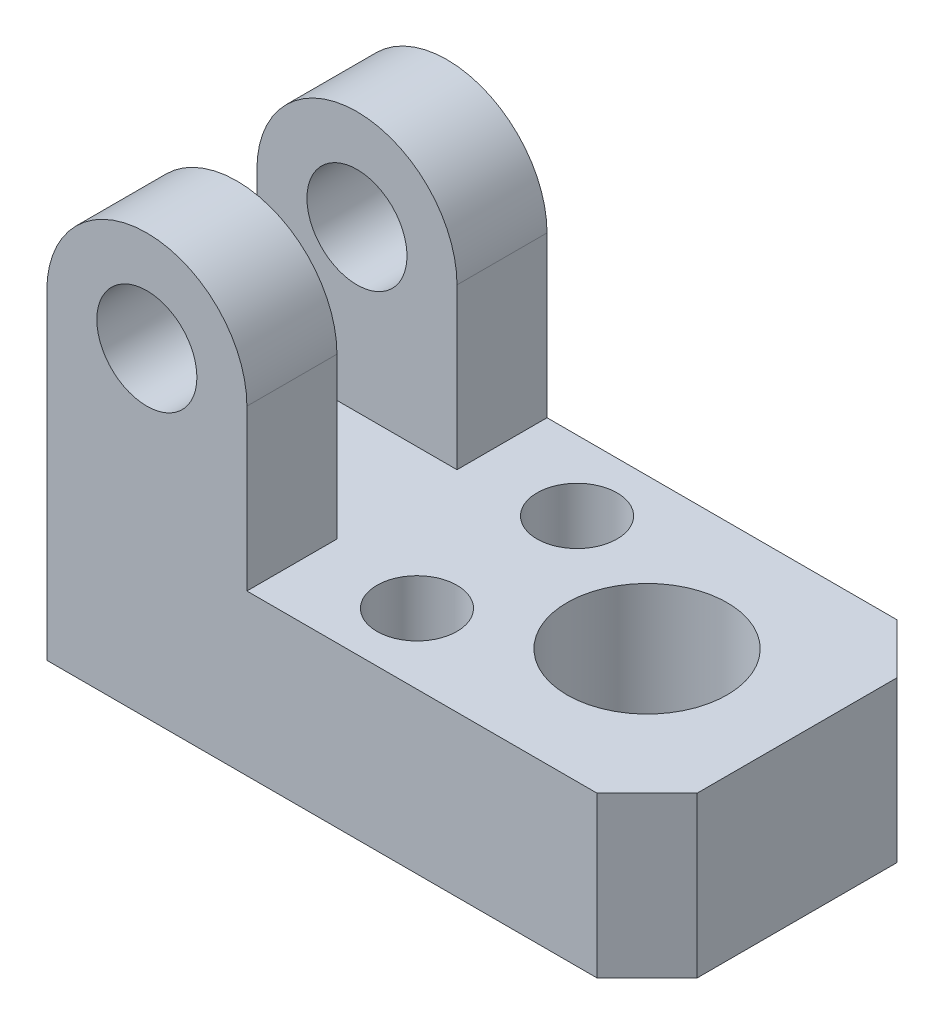
ISO-10303-21;
HEADER;
FILE_DESCRIPTION(('STEP AP214'),'2;1');
FILE_NAME('part.step','',(''),(''),'','','');
FILE_SCHEMA(('AUTOMOTIVE_DESIGN { 1 0 10303 214 1 1 1 1 }'));
ENDSEC;
DATA;
#1=APPLICATION_CONTEXT('core data for automotive mechanical design processes');
#2=APPLICATION_PROTOCOL_DEFINITION('international standard','automotive_design',2000,#1);
#3=PRODUCT_CONTEXT('',#1,'mechanical');
#4=PRODUCT('Part','Part','',(#3));
#5=PRODUCT_RELATED_PRODUCT_CATEGORY('part','',(#4));
#6=PRODUCT_DEFINITION_FORMATION('','',#4);
#7=PRODUCT_DEFINITION_CONTEXT('part definition',#1,'design');
#8=PRODUCT_DEFINITION('design','',#6,#7);
#9=PRODUCT_DEFINITION_SHAPE('','',#8);
#10=(LENGTH_UNIT() NAMED_UNIT(*) SI_UNIT(.MILLI.,.METRE.));
#11=(NAMED_UNIT(*) PLANE_ANGLE_UNIT() SI_UNIT($,.RADIAN.));
#12=(NAMED_UNIT(*) SI_UNIT($,.STERADIAN.) SOLID_ANGLE_UNIT());
#13=UNCERTAINTY_MEASURE_WITH_UNIT(LENGTH_MEASURE(1.E-05),#10,'distance_accuracy_value','');
#14=(GEOMETRIC_REPRESENTATION_CONTEXT(3) GLOBAL_UNCERTAINTY_ASSIGNED_CONTEXT((#13)) GLOBAL_UNIT_ASSIGNED_CONTEXT((#10,
#11,#12)) REPRESENTATION_CONTEXT('',''));
#15=CARTESIAN_POINT('',(0.,0.,0.));
#16=DIRECTION('',(0.,0.,1.));
#17=DIRECTION('',(1.,0.,0.));
#18=AXIS2_PLACEMENT_3D('',#15,#16,#17);
#19=CARTESIAN_POINT('',(0.,16.,0.));
#20=DIRECTION('',(0.,-1.,0.));
#21=DIRECTION('',(0.,0.,-1.));
#22=AXIS2_PLACEMENT_3D('',#19,#20,#21);
#23=PLANE('',#22);
#24=CARTESIAN_POINT('',(15.,16.,0.));
#25=DIRECTION('',(0.,1.,0.));
#26=DIRECTION('',(0.,0.,1.));
#27=AXIS2_PLACEMENT_3D('',#24,#25,#26);
#28=CIRCLE('',#27,8.);
#29=CARTESIAN_POINT('',(15.,16.,8.));
#30=VERTEX_POINT('',#29);
#31=EDGE_CURVE('E328',#30,#30,#28,.T.);
#32=ORIENTED_EDGE('',*,*,#31,.F.);
#33=EDGE_LOOP('',(#32));
#34=FACE_BOUND('',#33,.T.);
#35=CARTESIAN_POINT('',(0.,16.,8.));
#36=DIRECTION('',(0.,1.,0.));
#37=DIRECTION('',(0.,0.,1.));
#38=AXIS2_PLACEMENT_3D('',#35,#36,#37);
#39=CIRCLE('',#38,4.);
#40=CARTESIAN_POINT('',(0.,16.,12.));
#41=VERTEX_POINT('',#40);
#42=EDGE_CURVE('E325',#41,#41,#39,.T.);
#43=ORIENTED_EDGE('',*,*,#42,.F.);
#44=EDGE_LOOP('',(#43));
#45=FACE_BOUND('',#44,.T.);
#46=CARTESIAN_POINT('',(0.,16.,-8.));
#47=DIRECTION('',(0.,1.,0.));
#48=DIRECTION('',(0.,0.,-1.));
#49=AXIS2_PLACEMENT_3D('',#46,#47,#48);
#50=CIRCLE('',#49,4.);
#51=CARTESIAN_POINT('',(0.,16.,-12.));
#52=VERTEX_POINT('',#51);
#53=EDGE_CURVE('E319',#52,#52,#50,.T.);
#54=ORIENTED_EDGE('',*,*,#53,.F.);
#55=EDGE_LOOP('',(#54));
#56=FACE_BOUND('',#55,.T.);
#57=DIRECTION('',(1.,0.,0.));
#58=VECTOR('',#57,1.);
#59=CARTESIAN_POINT('',(-30.,16.,15.));
#60=LINE('',#59,#58);
#61=CARTESIAN_POINT('',(-10.,16.,15.));
#62=VERTEX_POINT('',#61);
#63=CARTESIAN_POINT('',(25.,16.,15.));
#64=VERTEX_POINT('',#63);
#65=EDGE_CURVE('E207',#62,#64,#60,.T.);
#66=ORIENTED_EDGE('',*,*,#65,.T.);
#67=DIRECTION('',(-0.707106781186549,0.,0.707106781186546));
#68=VECTOR('',#67,1.);
#69=CARTESIAN_POINT('',(30.,16.,9.99999999999999));
#70=LINE('',#69,#68);
#71=CARTESIAN_POINT('',(30.,16.,9.99999999999999));
#72=VERTEX_POINT('',#71);
#73=EDGE_CURVE('E50',#64,#72,#70,.F.);
#74=ORIENTED_EDGE('',*,*,#73,.T.);
#75=DIRECTION('',(0.,0.,-1.));
#76=VECTOR('',#75,1.);
#77=CARTESIAN_POINT('',(30.,16.,15.));
#78=LINE('',#77,#76);
#79=CARTESIAN_POINT('',(30.,16.,-9.99999999999997));
#80=VERTEX_POINT('',#79);
#81=EDGE_CURVE('E200',#72,#80,#78,.T.);
#82=ORIENTED_EDGE('',*,*,#81,.T.);
#83=DIRECTION('',(0.707106781186546,0.,0.707106781186549));
#84=VECTOR('',#83,1.);
#85=CARTESIAN_POINT('',(25.,16.,-15.));
#86=LINE('',#85,#84);
#87=CARTESIAN_POINT('',(25.,16.,-15.));
#88=VERTEX_POINT('',#87);
#89=EDGE_CURVE('E57',#80,#88,#86,.F.);
#90=ORIENTED_EDGE('',*,*,#89,.T.);
#91=DIRECTION('',(-1.,0.,0.));
#92=VECTOR('',#91,1.);
#93=CARTESIAN_POINT('',(-30.,16.,-15.));
#94=LINE('',#93,#92);
#95=CARTESIAN_POINT('',(-10.,16.,-15.));
#96=VERTEX_POINT('',#95);
#97=EDGE_CURVE('E202',#88,#96,#94,.T.);
#98=ORIENTED_EDGE('',*,*,#97,.T.);
#99=DIRECTION('',(0.,0.,-1.));
#100=VECTOR('',#99,1.);
#101=CARTESIAN_POINT('',(-10.,16.,-6.));
#102=LINE('',#101,#100);
#103=CARTESIAN_POINT('',(-10.,16.,-6.));
#104=VERTEX_POINT('',#103);
#105=EDGE_CURVE('E192',#104,#96,#102,.T.);
#106=ORIENTED_EDGE('',*,*,#105,.F.);
#107=DIRECTION('',(-1.,0.,0.));
#108=VECTOR('',#107,1.);
#109=CARTESIAN_POINT('',(-30.,16.,-6.));
#110=LINE('',#109,#108);
#111=CARTESIAN_POINT('',(-30.,16.,-6.));
#112=VERTEX_POINT('',#111);
#113=EDGE_CURVE('E183',#104,#112,#110,.T.);
#114=ORIENTED_EDGE('',*,*,#113,.T.);
#115=DIRECTION('',(0.,0.,1.));
#116=VECTOR('',#115,1.);
#117=CARTESIAN_POINT('',(-30.,16.,15.));
#118=LINE('',#117,#116);
#119=CARTESIAN_POINT('',(-30.,16.,6.));
#120=VERTEX_POINT('',#119);
#121=EDGE_CURVE('E205',#112,#120,#118,.T.);
#122=ORIENTED_EDGE('',*,*,#121,.T.);
#123=DIRECTION('',(-1.,0.,0.));
#124=VECTOR('',#123,1.);
#125=CARTESIAN_POINT('',(-30.,16.,6.));
#126=LINE('',#125,#124);
#127=CARTESIAN_POINT('',(-10.,16.,6.));
#128=VERTEX_POINT('',#127);
#129=EDGE_CURVE('E159',#128,#120,#126,.T.);
#130=ORIENTED_EDGE('',*,*,#129,.F.);
#131=DIRECTION('',(0.,0.,1.));
#132=VECTOR('',#131,1.);
#133=CARTESIAN_POINT('',(-10.,16.,6.));
#134=LINE('',#133,#132);
#135=EDGE_CURVE('E145',#128,#62,#134,.T.);
#136=ORIENTED_EDGE('',*,*,#135,.T.);
#137=EDGE_LOOP('',(#66,#74,#82,#90,#98,#106,#114,#122,#130,#136));
#138=FACE_BOUND('',#137,.T.);
#139=ADVANCED_FACE('F41',(#34,#45,#56,#138),#23,.F.);
#140=CARTESIAN_POINT('',(30.,16.,15.));
#141=DIRECTION('',(-1.,0.,0.));
#142=DIRECTION('',(0.,0.,1.));
#143=AXIS2_PLACEMENT_3D('',#140,#141,#142);
#144=PLANE('',#143);
#145=ORIENTED_EDGE('',*,*,#81,.F.);
#146=DIRECTION('',(0.,-1.,0.));
#147=VECTOR('',#146,1.);
#148=CARTESIAN_POINT('',(30.,16.,9.99999999999999));
#149=LINE('',#148,#147);
#150=CARTESIAN_POINT('',(30.,0.,9.99999999999999));
#151=VERTEX_POINT('',#150);
#152=EDGE_CURVE('E229',#72,#151,#149,.T.);
#153=ORIENTED_EDGE('',*,*,#152,.T.);
#154=DIRECTION('',(0.,0.,-1.));
#155=VECTOR('',#154,1.);
#156=CARTESIAN_POINT('',(30.,0.,15.));
#157=LINE('',#156,#155);
#158=CARTESIAN_POINT('',(30.,0.,-9.99999999999997));
#159=VERTEX_POINT('',#158);
#160=EDGE_CURVE('E195',#151,#159,#157,.T.);
#161=ORIENTED_EDGE('',*,*,#160,.T.);
#162=DIRECTION('',(0.,1.,0.));
#163=VECTOR('',#162,1.);
#164=CARTESIAN_POINT('',(30.,16.,-9.99999999999997));
#165=LINE('',#164,#163);
#166=EDGE_CURVE('E222',#159,#80,#165,.T.);
#167=ORIENTED_EDGE('',*,*,#166,.T.);
#168=EDGE_LOOP('',(#145,#153,#161,#167));
#169=FACE_BOUND('',#168,.T.);
#170=ADVANCED_FACE('F242',(#169),#144,.F.);
#171=CARTESIAN_POINT('',(-30.,16.,-15.));
#172=DIRECTION('',(0.,0.,1.));
#173=DIRECTION('',(1.,0.,0.));
#174=AXIS2_PLACEMENT_3D('',#171,#172,#173);
#175=PLANE('',#174);
#176=CARTESIAN_POINT('',(-20.,32.,-15.));
#177=DIRECTION('',(0.,0.,-1.));
#178=DIRECTION('',(-1.,0.,0.));
#179=AXIS2_PLACEMENT_3D('',#176,#177,#178);
#180=CIRCLE('',#179,5.);
#181=CARTESIAN_POINT('',(-25.,32.,-15.));
#182=VERTEX_POINT('',#181);
#183=EDGE_CURVE('E168',#182,#182,#180,.T.);
#184=ORIENTED_EDGE('',*,*,#183,.F.);
#185=EDGE_LOOP('',(#184));
#186=FACE_BOUND('',#185,.T.);
#187=ORIENTED_EDGE('',*,*,#97,.F.);
#188=DIRECTION('',(0.,-1.,0.));
#189=VECTOR('',#188,1.);
#190=CARTESIAN_POINT('',(25.,16.,-15.));
#191=LINE('',#190,#189);
#192=CARTESIAN_POINT('',(25.,0.,-15.));
#193=VERTEX_POINT('',#192);
#194=EDGE_CURVE('E11',#88,#193,#191,.T.);
#195=ORIENTED_EDGE('',*,*,#194,.T.);
#196=DIRECTION('',(-1.,0.,0.));
#197=VECTOR('',#196,1.);
#198=CARTESIAN_POINT('',(-30.,0.,-15.));
#199=LINE('',#198,#197);
#200=CARTESIAN_POINT('',(-30.,0.,-15.));
#201=VERTEX_POINT('',#200);
#202=EDGE_CURVE('E212',#193,#201,#199,.T.);
#203=ORIENTED_EDGE('',*,*,#202,.T.);
#204=DIRECTION('',(0.,-1.,0.));
#205=VECTOR('',#204,1.);
#206=CARTESIAN_POINT('',(-30.,16.,-15.));
#207=LINE('',#206,#205);
#208=CARTESIAN_POINT('',(-30.,32.,-15.));
#209=VERTEX_POINT('',#208);
#210=EDGE_CURVE('E219',#209,#201,#207,.T.);
#211=ORIENTED_EDGE('',*,*,#210,.F.);
#212=CARTESIAN_POINT('',(-20.,32.,-15.));
#213=DIRECTION('',(0.,0.,-1.));
#214=DIRECTION('',(-1.,0.,0.));
#215=AXIS2_PLACEMENT_3D('',#212,#213,#214);
#216=CIRCLE('',#215,10.);
#217=CARTESIAN_POINT('',(-10.,32.,-15.));
#218=VERTEX_POINT('',#217);
#219=EDGE_CURVE('E187',#209,#218,#216,.T.);
#220=ORIENTED_EDGE('',*,*,#219,.T.);
#221=DIRECTION('',(0.,-1.,0.));
#222=VECTOR('',#221,1.);
#223=CARTESIAN_POINT('',(-10.,16.,-15.));
#224=LINE('',#223,#222);
#225=EDGE_CURVE('E178',#218,#96,#224,.T.);
#226=ORIENTED_EDGE('',*,*,#225,.T.);
#227=EDGE_LOOP('',(#187,#195,#203,#211,#220,#226));
#228=FACE_BOUND('',#227,.T.);
#229=ADVANCED_FACE('F255',(#186,#228),#175,.F.);
#230=CARTESIAN_POINT('',(-30.,16.,15.));
#231=DIRECTION('',(1.,0.,0.));
#232=DIRECTION('',(0.,0.,-1.));
#233=AXIS2_PLACEMENT_3D('',#230,#231,#232);
#234=PLANE('',#233);
#235=DIRECTION('',(0.,0.,1.));
#236=VECTOR('',#235,1.);
#237=CARTESIAN_POINT('',(-30.,0.,15.));
#238=LINE('',#237,#236);
#239=CARTESIAN_POINT('',(-30.,0.,15.));
#240=VERTEX_POINT('',#239);
#241=EDGE_CURVE('E214',#201,#240,#238,.T.);
#242=ORIENTED_EDGE('',*,*,#241,.T.);
#243=DIRECTION('',(0.,-1.,0.));
#244=VECTOR('',#243,1.);
#245=CARTESIAN_POINT('',(-30.,16.,15.));
#246=LINE('',#245,#244);
#247=CARTESIAN_POINT('',(-30.,32.,15.));
#248=VERTEX_POINT('',#247);
#249=EDGE_CURVE('E209',#248,#240,#246,.T.);
#250=ORIENTED_EDGE('',*,*,#249,.F.);
#251=DIRECTION('',(0.,0.,1.));
#252=VECTOR('',#251,1.);
#253=CARTESIAN_POINT('',(-30.,32.,6.));
#254=LINE('',#253,#252);
#255=CARTESIAN_POINT('',(-30.,32.,6.));
#256=VERTEX_POINT('',#255);
#257=EDGE_CURVE('E155',#256,#248,#254,.T.);
#258=ORIENTED_EDGE('',*,*,#257,.F.);
#259=DIRECTION('',(0.,1.,0.));
#260=VECTOR('',#259,1.);
#261=CARTESIAN_POINT('',(-30.,16.,6.));
#262=LINE('',#261,#260);
#263=EDGE_CURVE('E141',#120,#256,#262,.T.);
#264=ORIENTED_EDGE('',*,*,#263,.F.);
#265=ORIENTED_EDGE('',*,*,#121,.F.);
#266=DIRECTION('',(0.,1.,0.));
#267=VECTOR('',#266,1.);
#268=CARTESIAN_POINT('',(-30.,16.,-6.));
#269=LINE('',#268,#267);
#270=CARTESIAN_POINT('',(-30.,32.,-6.));
#271=VERTEX_POINT('',#270);
#272=EDGE_CURVE('E174',#112,#271,#269,.T.);
#273=ORIENTED_EDGE('',*,*,#272,.T.);
#274=DIRECTION('',(0.,0.,-1.));
#275=VECTOR('',#274,1.);
#276=CARTESIAN_POINT('',(-30.,32.,-6.));
#277=LINE('',#276,#275);
#278=EDGE_CURVE('E186',#271,#209,#277,.T.);
#279=ORIENTED_EDGE('',*,*,#278,.T.);
#280=ORIENTED_EDGE('',*,*,#210,.T.);
#281=EDGE_LOOP('',(#242,#250,#258,#264,#265,#273,#279,#280));
#282=FACE_BOUND('',#281,.T.);
#283=ADVANCED_FACE('F252',(#282),#234,.F.);
#284=CARTESIAN_POINT('',(-30.,16.,15.));
#285=DIRECTION('',(0.,0.,-1.));
#286=DIRECTION('',(-1.,0.,0.));
#287=AXIS2_PLACEMENT_3D('',#284,#285,#286);
#288=PLANE('',#287);
#289=CARTESIAN_POINT('',(-20.,32.,15.));
#290=DIRECTION('',(0.,0.,-1.));
#291=DIRECTION('',(-1.,0.,0.));
#292=AXIS2_PLACEMENT_3D('',#289,#290,#291);
#293=CIRCLE('',#292,5.);
#294=CARTESIAN_POINT('',(-25.,32.,15.));
#295=VERTEX_POINT('',#294);
#296=EDGE_CURVE('E227',#295,#295,#293,.T.);
#297=ORIENTED_EDGE('',*,*,#296,.T.);
#298=EDGE_LOOP('',(#297));
#299=FACE_BOUND('',#298,.T.);
#300=DIRECTION('',(1.,0.,0.));
#301=VECTOR('',#300,1.);
#302=CARTESIAN_POINT('',(-30.,0.,15.));
#303=LINE('',#302,#301);
#304=CARTESIAN_POINT('',(25.,0.,15.));
#305=VERTEX_POINT('',#304);
#306=EDGE_CURVE('E203',#240,#305,#303,.T.);
#307=ORIENTED_EDGE('',*,*,#306,.T.);
#308=DIRECTION('',(0.,1.,0.));
#309=VECTOR('',#308,1.);
#310=CARTESIAN_POINT('',(25.,16.,15.));
#311=LINE('',#310,#309);
#312=EDGE_CURVE('E65',#305,#64,#311,.T.);
#313=ORIENTED_EDGE('',*,*,#312,.T.);
#314=ORIENTED_EDGE('',*,*,#65,.F.);
#315=DIRECTION('',(0.,-1.,0.));
#316=VECTOR('',#315,1.);
#317=CARTESIAN_POINT('',(-10.,16.,15.));
#318=LINE('',#317,#316);
#319=CARTESIAN_POINT('',(-10.,32.,15.));
#320=VERTEX_POINT('',#319);
#321=EDGE_CURVE('E164',#320,#62,#318,.T.);
#322=ORIENTED_EDGE('',*,*,#321,.F.);
#323=CARTESIAN_POINT('',(-20.,32.,15.));
#324=DIRECTION('',(0.,0.,-1.));
#325=DIRECTION('',(-1.,0.,0.));
#326=AXIS2_PLACEMENT_3D('',#323,#324,#325);
#327=CIRCLE('',#326,10.);
#328=EDGE_CURVE('E151',#248,#320,#327,.T.);
#329=ORIENTED_EDGE('',*,*,#328,.F.);
#330=ORIENTED_EDGE('',*,*,#249,.T.);
#331=EDGE_LOOP('',(#307,#313,#314,#322,#329,#330));
#332=FACE_BOUND('',#331,.T.);
#333=ADVANCED_FACE('F250',(#299,#332),#288,.F.);
#334=CARTESIAN_POINT('',(0.,0.,0.));
#335=DIRECTION('',(0.,-1.,0.));
#336=DIRECTION('',(0.,0.,-1.));
#337=AXIS2_PLACEMENT_3D('',#334,#335,#336);
#338=PLANE('',#337);
#339=CARTESIAN_POINT('',(15.,0.,0.));
#340=DIRECTION('',(0.,1.,0.));
#341=DIRECTION('',(0.,0.,1.));
#342=AXIS2_PLACEMENT_3D('',#339,#340,#341);
#343=CIRCLE('',#342,8.);
#344=CARTESIAN_POINT('',(15.,0.,8.));
#345=VERTEX_POINT('',#344);
#346=EDGE_CURVE('E315',#345,#345,#343,.T.);
#347=ORIENTED_EDGE('',*,*,#346,.T.);
#348=EDGE_LOOP('',(#347));
#349=FACE_BOUND('',#348,.T.);
#350=CARTESIAN_POINT('',(0.,0.,8.));
#351=DIRECTION('',(0.,1.,0.));
#352=DIRECTION('',(0.,0.,1.));
#353=AXIS2_PLACEMENT_3D('',#350,#351,#352);
#354=CIRCLE('',#353,4.);
#355=CARTESIAN_POINT('',(0.,0.,12.));
#356=VERTEX_POINT('',#355);
#357=EDGE_CURVE('E322',#356,#356,#354,.T.);
#358=ORIENTED_EDGE('',*,*,#357,.T.);
#359=EDGE_LOOP('',(#358));
#360=FACE_BOUND('',#359,.T.);
#361=CARTESIAN_POINT('',(0.,0.,-8.));
#362=DIRECTION('',(0.,1.,0.));
#363=DIRECTION('',(0.,0.,-1.));
#364=AXIS2_PLACEMENT_3D('',#361,#362,#363);
#365=CIRCLE('',#364,4.);
#366=CARTESIAN_POINT('',(0.,0.,-12.));
#367=VERTEX_POINT('',#366);
#368=EDGE_CURVE('E316',#367,#367,#365,.T.);
#369=ORIENTED_EDGE('',*,*,#368,.T.);
#370=EDGE_LOOP('',(#369));
#371=FACE_BOUND('',#370,.T.);
#372=ORIENTED_EDGE('',*,*,#160,.F.);
#373=DIRECTION('',(0.707106781186549,0.,-0.707106781186546));
#374=VECTOR('',#373,1.);
#375=CARTESIAN_POINT('',(19.9999999999999,0.,20.));
#376=LINE('',#375,#374);
#377=EDGE_CURVE('E234',#151,#305,#376,.F.);
#378=ORIENTED_EDGE('',*,*,#377,.T.);
#379=ORIENTED_EDGE('',*,*,#306,.F.);
#380=ORIENTED_EDGE('',*,*,#241,.F.);
#381=ORIENTED_EDGE('',*,*,#202,.F.);
#382=DIRECTION('',(-0.707106781186546,0.,-0.707106781186549));
#383=VECTOR('',#382,1.);
#384=CARTESIAN_POINT('',(20.,0.,-20.));
#385=LINE('',#384,#383);
#386=EDGE_CURVE('E232',#193,#159,#385,.F.);
#387=ORIENTED_EDGE('',*,*,#386,.T.);
#388=EDGE_LOOP('',(#372,#378,#379,#380,#381,#387));
#389=FACE_BOUND('',#388,.T.);
#390=ADVANCED_FACE('F248',(#349,#360,#371,#389),#338,.T.);
#391=CARTESIAN_POINT('',(-10.,16.,-6.));
#392=DIRECTION('',(1.,0.,0.));
#393=DIRECTION('',(0.,0.,-1.));
#394=AXIS2_PLACEMENT_3D('',#391,#392,#393);
#395=PLANE('',#394);
#396=ORIENTED_EDGE('',*,*,#225,.F.);
#397=DIRECTION('',(0.,0.,-1.));
#398=VECTOR('',#397,1.);
#399=CARTESIAN_POINT('',(-10.,32.,-6.));
#400=LINE('',#399,#398);
#401=CARTESIAN_POINT('',(-10.,32.,-6.));
#402=VERTEX_POINT('',#401);
#403=EDGE_CURVE('E196',#402,#218,#400,.T.);
#404=ORIENTED_EDGE('',*,*,#403,.F.);
#405=DIRECTION('',(0.,-1.,0.));
#406=VECTOR('',#405,1.);
#407=CARTESIAN_POINT('',(-10.,16.,-6.));
#408=LINE('',#407,#406);
#409=EDGE_CURVE('E181',#402,#104,#408,.T.);
#410=ORIENTED_EDGE('',*,*,#409,.T.);
#411=ORIENTED_EDGE('',*,*,#105,.T.);
#412=EDGE_LOOP('',(#396,#404,#410,#411));
#413=FACE_BOUND('',#412,.T.);
#414=ADVANCED_FACE('F279',(#413),#395,.T.);
#415=CARTESIAN_POINT('',(-20.,32.,-6.));
#416=DIRECTION('',(0.,0.,-1.));
#417=DIRECTION('',(-1.,0.,0.));
#418=AXIS2_PLACEMENT_3D('',#415,#416,#417);
#419=CYLINDRICAL_SURFACE('',#418,10.);
#420=ORIENTED_EDGE('',*,*,#219,.F.);
#421=ORIENTED_EDGE('',*,*,#278,.F.);
#422=CARTESIAN_POINT('',(-20.,32.,-6.));
#423=DIRECTION('',(0.,0.,-1.));
#424=DIRECTION('',(-1.,0.,0.));
#425=AXIS2_PLACEMENT_3D('',#422,#423,#424);
#426=CIRCLE('',#425,10.);
#427=EDGE_CURVE('E177',#271,#402,#426,.T.);
#428=ORIENTED_EDGE('',*,*,#427,.T.);
#429=ORIENTED_EDGE('',*,*,#403,.T.);
#430=EDGE_LOOP('',(#420,#421,#428,#429));
#431=FACE_BOUND('',#430,.T.);
#432=ADVANCED_FACE('F275',(#431),#419,.T.);
#433=CARTESIAN_POINT('',(-20.,32.,-6.));
#434=DIRECTION('',(0.,0.,-1.));
#435=DIRECTION('',(-1.,0.,0.));
#436=AXIS2_PLACEMENT_3D('',#433,#434,#435);
#437=PLANE('',#436);
#438=CARTESIAN_POINT('',(-20.,32.,-6.));
#439=DIRECTION('',(0.,0.,-1.));
#440=DIRECTION('',(-1.,0.,0.));
#441=AXIS2_PLACEMENT_3D('',#438,#439,#440);
#442=CIRCLE('',#441,5.);
#443=CARTESIAN_POINT('',(-25.,32.,-6.));
#444=VERTEX_POINT('',#443);
#445=EDGE_CURVE('E173',#444,#444,#442,.T.);
#446=ORIENTED_EDGE('',*,*,#445,.T.);
#447=EDGE_LOOP('',(#446));
#448=FACE_BOUND('',#447,.T.);
#449=ORIENTED_EDGE('',*,*,#272,.F.);
#450=ORIENTED_EDGE('',*,*,#113,.F.);
#451=ORIENTED_EDGE('',*,*,#409,.F.);
#452=ORIENTED_EDGE('',*,*,#427,.F.);
#453=EDGE_LOOP('',(#449,#450,#451,#452));
#454=FACE_BOUND('',#453,.T.);
#455=ADVANCED_FACE('F300',(#448,#454),#437,.F.);
#456=CARTESIAN_POINT('',(-20.,32.,15.));
#457=DIRECTION('',(0.,0.,-1.));
#458=DIRECTION('',(-1.,0.,0.));
#459=AXIS2_PLACEMENT_3D('',#456,#457,#458);
#460=CYLINDRICAL_SURFACE('',#459,5.);
#461=ORIENTED_EDGE('',*,*,#183,.T.);
#462=EDGE_LOOP('',(#461));
#463=FACE_BOUND('',#462,.T.);
#464=ORIENTED_EDGE('',*,*,#445,.F.);
#465=EDGE_LOOP('',(#464));
#466=FACE_BOUND('',#465,.T.);
#467=ADVANCED_FACE('F297',(#463,#466),#460,.F.);
#468=CARTESIAN_POINT('',(-20.,32.,6.));
#469=DIRECTION('',(0.,0.,1.));
#470=DIRECTION('',(1.,0.,0.));
#471=AXIS2_PLACEMENT_3D('',#468,#469,#470);
#472=CYLINDRICAL_SURFACE('',#471,10.);
#473=ORIENTED_EDGE('',*,*,#328,.T.);
#474=DIRECTION('',(0.,0.,1.));
#475=VECTOR('',#474,1.);
#476=CARTESIAN_POINT('',(-10.,32.,6.));
#477=LINE('',#476,#475);
#478=CARTESIAN_POINT('',(-10.,32.,6.));
#479=VERTEX_POINT('',#478);
#480=EDGE_CURVE('E148',#479,#320,#477,.T.);
#481=ORIENTED_EDGE('',*,*,#480,.F.);
#482=CARTESIAN_POINT('',(-20.,32.,6.));
#483=DIRECTION('',(0.,0.,-1.));
#484=DIRECTION('',(-1.,0.,0.));
#485=AXIS2_PLACEMENT_3D('',#482,#483,#484);
#486=CIRCLE('',#485,10.);
#487=EDGE_CURVE('E133',#256,#479,#486,.T.);
#488=ORIENTED_EDGE('',*,*,#487,.F.);
#489=ORIENTED_EDGE('',*,*,#257,.T.);
#490=EDGE_LOOP('',(#473,#481,#488,#489));
#491=FACE_BOUND('',#490,.T.);
#492=ADVANCED_FACE('F149',(#491),#472,.T.);
#493=CARTESIAN_POINT('',(-10.,16.,6.));
#494=DIRECTION('',(-1.,0.,0.));
#495=DIRECTION('',(0.,0.,1.));
#496=AXIS2_PLACEMENT_3D('',#493,#494,#495);
#497=PLANE('',#496);
#498=ORIENTED_EDGE('',*,*,#321,.T.);
#499=ORIENTED_EDGE('',*,*,#135,.F.);
#500=DIRECTION('',(0.,-1.,0.));
#501=VECTOR('',#500,1.);
#502=CARTESIAN_POINT('',(-10.,16.,6.));
#503=LINE('',#502,#501);
#504=EDGE_CURVE('E138',#479,#128,#503,.T.);
#505=ORIENTED_EDGE('',*,*,#504,.F.);
#506=ORIENTED_EDGE('',*,*,#480,.T.);
#507=EDGE_LOOP('',(#498,#499,#505,#506));
#508=FACE_BOUND('',#507,.T.);
#509=ADVANCED_FACE('F157',(#508),#497,.F.);
#510=CARTESIAN_POINT('',(-20.,32.,6.));
#511=DIRECTION('',(0.,0.,1.));
#512=DIRECTION('',(-1.,0.,0.));
#513=AXIS2_PLACEMENT_3D('',#510,#511,#512);
#514=PLANE('',#513);
#515=CARTESIAN_POINT('',(-20.,32.,6.));
#516=DIRECTION('',(0.,0.,1.));
#517=DIRECTION('',(1.,0.,0.));
#518=AXIS2_PLACEMENT_3D('',#515,#516,#517);
#519=CIRCLE('',#518,5.);
#520=CARTESIAN_POINT('',(-15.,32.,6.));
#521=VERTEX_POINT('',#520);
#522=EDGE_CURVE('E166',#521,#521,#519,.F.);
#523=ORIENTED_EDGE('',*,*,#522,.F.);
#524=EDGE_LOOP('',(#523));
#525=FACE_BOUND('',#524,.T.);
#526=ORIENTED_EDGE('',*,*,#263,.T.);
#527=ORIENTED_EDGE('',*,*,#487,.T.);
#528=ORIENTED_EDGE('',*,*,#504,.T.);
#529=ORIENTED_EDGE('',*,*,#129,.T.);
#530=EDGE_LOOP('',(#526,#527,#528,#529));
#531=FACE_BOUND('',#530,.T.);
#532=ADVANCED_FACE('F135',(#525,#531),#514,.F.);
#533=CARTESIAN_POINT('',(-20.,32.,-15.));
#534=DIRECTION('',(0.,0.,1.));
#535=DIRECTION('',(1.,0.,0.));
#536=AXIS2_PLACEMENT_3D('',#533,#534,#535);
#537=CYLINDRICAL_SURFACE('',#536,5.);
#538=ORIENTED_EDGE('',*,*,#296,.F.);
#539=EDGE_LOOP('',(#538));
#540=FACE_BOUND('',#539,.T.);
#541=ORIENTED_EDGE('',*,*,#522,.T.);
#542=EDGE_LOOP('',(#541));
#543=FACE_BOUND('',#542,.T.);
#544=ADVANCED_FACE('F347',(#540,#543),#537,.F.);
#545=CARTESIAN_POINT('',(0.,0.,-8.));
#546=DIRECTION('',(0.,1.,0.));
#547=DIRECTION('',(0.,0.,1.));
#548=AXIS2_PLACEMENT_3D('',#545,#546,#547);
#549=CYLINDRICAL_SURFACE('',#548,4.);
#550=ORIENTED_EDGE('',*,*,#368,.F.);
#551=EDGE_LOOP('',(#550));
#552=FACE_BOUND('',#551,.T.);
#553=ORIENTED_EDGE('',*,*,#53,.T.);
#554=EDGE_LOOP('',(#553));
#555=FACE_BOUND('',#554,.T.);
#556=ADVANCED_FACE('F341',(#552,#555),#549,.F.);
#557=CARTESIAN_POINT('',(0.,0.,8.));
#558=DIRECTION('',(0.,1.,0.));
#559=DIRECTION('',(0.,0.,1.));
#560=AXIS2_PLACEMENT_3D('',#557,#558,#559);
#561=CYLINDRICAL_SURFACE('',#560,4.);
#562=ORIENTED_EDGE('',*,*,#357,.F.);
#563=EDGE_LOOP('',(#562));
#564=FACE_BOUND('',#563,.T.);
#565=ORIENTED_EDGE('',*,*,#42,.T.);
#566=EDGE_LOOP('',(#565));
#567=FACE_BOUND('',#566,.T.);
#568=ADVANCED_FACE('F336',(#564,#567),#561,.F.);
#569=CARTESIAN_POINT('',(15.,0.,0.));
#570=DIRECTION('',(0.,1.,0.));
#571=DIRECTION('',(0.,0.,1.));
#572=AXIS2_PLACEMENT_3D('',#569,#570,#571);
#573=CYLINDRICAL_SURFACE('',#572,8.);
#574=ORIENTED_EDGE('',*,*,#346,.F.);
#575=EDGE_LOOP('',(#574));
#576=FACE_BOUND('',#575,.T.);
#577=ORIENTED_EDGE('',*,*,#31,.T.);
#578=EDGE_LOOP('',(#577));
#579=FACE_BOUND('',#578,.T.);
#580=ADVANCED_FACE('F262',(#576,#579),#573,.F.);
#581=CARTESIAN_POINT('',(30.,16.,9.99999999999999));
#582=DIRECTION('',(-0.707106781186546,0.,-0.707106781186549));
#583=DIRECTION('',(0.,-1.,0.));
#584=AXIS2_PLACEMENT_3D('',#581,#582,#583);
#585=PLANE('',#584);
#586=ORIENTED_EDGE('',*,*,#73,.F.);
#587=ORIENTED_EDGE('',*,*,#312,.F.);
#588=ORIENTED_EDGE('',*,*,#377,.F.);
#589=ORIENTED_EDGE('',*,*,#152,.F.);
#590=EDGE_LOOP('',(#586,#587,#588,#589));
#591=FACE_BOUND('',#590,.T.);
#592=ADVANCED_FACE('F245',(#591),#585,.F.);
#593=CARTESIAN_POINT('',(25.,16.,-15.));
#594=DIRECTION('',(-0.707106781186549,0.,0.707106781186546));
#595=DIRECTION('',(0.,-1.,0.));
#596=AXIS2_PLACEMENT_3D('',#593,#594,#595);
#597=PLANE('',#596);
#598=ORIENTED_EDGE('',*,*,#89,.F.);
#599=ORIENTED_EDGE('',*,*,#166,.F.);
#600=ORIENTED_EDGE('',*,*,#386,.F.);
#601=ORIENTED_EDGE('',*,*,#194,.F.);
#602=EDGE_LOOP('',(#598,#599,#600,#601));
#603=FACE_BOUND('',#602,.T.);
#604=ADVANCED_FACE('F44',(#603),#597,.F.);
#605=CLOSED_SHELL('',(#139,#170,#229,#283,#333,#390,#414,#432,#455,#467,#492,#509,#532,#544,
#556,#568,#580,#592,#604));
#606=MANIFOLD_SOLID_BREP('B2',#605);
#607=ADVANCED_BREP_SHAPE_REPRESENTATION('',(#18,#606),#14);
#608=SHAPE_DEFINITION_REPRESENTATION(#9,#607);
ENDSEC;
END-ISO-10303-21;
